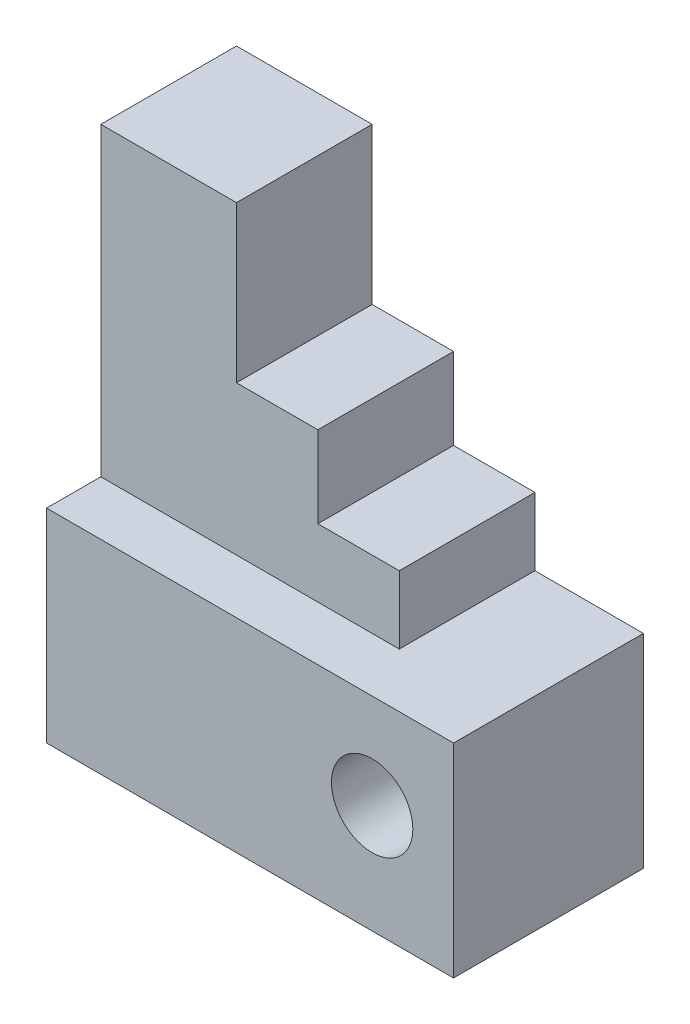
ISO-10303-21;
HEADER;
FILE_DESCRIPTION(('STEP AP214'),'2;1');
FILE_NAME('part.step','',(''),(''),'','','');
FILE_SCHEMA(('AUTOMOTIVE_DESIGN { 1 0 10303 214 1 1 1 1 }'));
ENDSEC;
DATA;
#1=APPLICATION_CONTEXT('core data for automotive mechanical design processes');
#2=APPLICATION_PROTOCOL_DEFINITION('international standard','automotive_design',2000,#1);
#3=PRODUCT_CONTEXT('',#1,'mechanical');
#4=PRODUCT('Part','Part','',(#3));
#5=PRODUCT_RELATED_PRODUCT_CATEGORY('part','',(#4));
#6=PRODUCT_DEFINITION_FORMATION('','',#4);
#7=PRODUCT_DEFINITION_CONTEXT('part definition',#1,'design');
#8=PRODUCT_DEFINITION('design','',#6,#7);
#9=PRODUCT_DEFINITION_SHAPE('','',#8);
#10=(LENGTH_UNIT() NAMED_UNIT(*) SI_UNIT(.MILLI.,.METRE.));
#11=(NAMED_UNIT(*) PLANE_ANGLE_UNIT() SI_UNIT($,.RADIAN.));
#12=(NAMED_UNIT(*) SI_UNIT($,.STERADIAN.) SOLID_ANGLE_UNIT());
#13=UNCERTAINTY_MEASURE_WITH_UNIT(LENGTH_MEASURE(1.E-05),#10,'distance_accuracy_value','');
#14=(GEOMETRIC_REPRESENTATION_CONTEXT(3) GLOBAL_UNCERTAINTY_ASSIGNED_CONTEXT((#13)) GLOBAL_UNIT_ASSIGNED_CONTEXT((#10,
#11,#12)) REPRESENTATION_CONTEXT('',''));
#15=CARTESIAN_POINT('',(0.,0.,0.));
#16=DIRECTION('',(0.,0.,1.));
#17=DIRECTION('',(1.,0.,0.));
#18=AXIS2_PLACEMENT_3D('',#15,#16,#17);
#19=CARTESIAN_POINT('',(0.,0.,28.));
#20=DIRECTION('',(0.,1.,0.));
#21=DIRECTION('',(0.,0.,1.));
#22=AXIS2_PLACEMENT_3D('',#19,#20,#21);
#23=PLANE('',#22);
#24=DIRECTION('',(1.,0.,0.));
#25=VECTOR('',#24,1.);
#26=CARTESIAN_POINT('',(0.,0.,0.));
#27=LINE('',#26,#25);
#28=CARTESIAN_POINT('',(0.,0.,0.));
#29=VERTEX_POINT('',#28);
#30=CARTESIAN_POINT('',(60.,0.,0.));
#31=VERTEX_POINT('',#30);
#32=EDGE_CURVE('E154',#29,#31,#27,.T.);
#33=ORIENTED_EDGE('',*,*,#32,.T.);
#34=DIRECTION('',(0.,0.,-1.));
#35=VECTOR('',#34,1.);
#36=CARTESIAN_POINT('',(60.,0.,28.));
#37=LINE('',#36,#35);
#38=CARTESIAN_POINT('',(60.,0.,28.));
#39=VERTEX_POINT('',#38);
#40=EDGE_CURVE('E11',#39,#31,#37,.T.);
#41=ORIENTED_EDGE('',*,*,#40,.F.);
#42=DIRECTION('',(1.,0.,0.));
#43=VECTOR('',#42,1.);
#44=CARTESIAN_POINT('',(0.,0.,28.));
#45=LINE('',#44,#43);
#46=CARTESIAN_POINT('',(0.,0.,28.));
#47=VERTEX_POINT('',#46);
#48=EDGE_CURVE('E164',#47,#39,#45,.T.);
#49=ORIENTED_EDGE('',*,*,#48,.F.);
#50=DIRECTION('',(0.,0.,-1.));
#51=VECTOR('',#50,1.);
#52=CARTESIAN_POINT('',(0.,0.,28.));
#53=LINE('',#52,#51);
#54=EDGE_CURVE('E179',#47,#29,#53,.T.);
#55=ORIENTED_EDGE('',*,*,#54,.T.);
#56=EDGE_LOOP('',(#33,#41,#49,#55));
#57=FACE_BOUND('',#56,.T.);
#58=ADVANCED_FACE('F41',(#57),#23,.F.);
#59=CARTESIAN_POINT('',(60.,0.,28.));
#60=DIRECTION('',(-1.,0.,0.));
#61=DIRECTION('',(0.,0.,1.));
#62=AXIS2_PLACEMENT_3D('',#59,#60,#61);
#63=PLANE('',#62);
#64=DIRECTION('',(0.,1.,0.));
#65=VECTOR('',#64,1.);
#66=CARTESIAN_POINT('',(60.,0.,0.));
#67=LINE('',#66,#65);
#68=CARTESIAN_POINT('',(60.,30.,0.));
#69=VERTEX_POINT('',#68);
#70=EDGE_CURVE('E184',#31,#69,#67,.T.);
#71=ORIENTED_EDGE('',*,*,#70,.T.);
#72=DIRECTION('',(0.,0.,-1.));
#73=VECTOR('',#72,1.);
#74=CARTESIAN_POINT('',(60.,30.,28.));
#75=LINE('',#74,#73);
#76=CARTESIAN_POINT('',(60.,30.,28.));
#77=VERTEX_POINT('',#76);
#78=EDGE_CURVE('E50',#77,#69,#75,.T.);
#79=ORIENTED_EDGE('',*,*,#78,.F.);
#80=DIRECTION('',(0.,1.,0.));
#81=VECTOR('',#80,1.);
#82=CARTESIAN_POINT('',(60.,0.,28.));
#83=LINE('',#82,#81);
#84=EDGE_CURVE('E169',#39,#77,#83,.T.);
#85=ORIENTED_EDGE('',*,*,#84,.F.);
#86=ORIENTED_EDGE('',*,*,#40,.T.);
#87=EDGE_LOOP('',(#71,#79,#85,#86));
#88=FACE_BOUND('',#87,.T.);
#89=ADVANCED_FACE('F201',(#88),#63,.F.);
#90=CARTESIAN_POINT('',(0.,30.,28.));
#91=DIRECTION('',(0.,1.,0.));
#92=DIRECTION('',(0.,0.,1.));
#93=AXIS2_PLACEMENT_3D('',#90,#91,#92);
#94=PLANE('',#93);
#95=DIRECTION('',(0.,0.,-1.));
#96=VECTOR('',#95,1.);
#97=CARTESIAN_POINT('',(44.,30.,20.));
#98=LINE('',#97,#96);
#99=CARTESIAN_POINT('',(44.,30.,20.));
#100=VERTEX_POINT('',#99);
#101=CARTESIAN_POINT('',(44.,30.,0.));
#102=VERTEX_POINT('',#101);
#103=EDGE_CURVE('E228',#100,#102,#98,.T.);
#104=ORIENTED_EDGE('',*,*,#103,.F.);
#105=DIRECTION('',(1.,0.,0.));
#106=VECTOR('',#105,1.);
#107=CARTESIAN_POINT('',(44.,30.,20.));
#108=LINE('',#107,#106);
#109=CARTESIAN_POINT('',(0.,30.,20.));
#110=VERTEX_POINT('',#109);
#111=EDGE_CURVE('E57',#110,#100,#108,.T.);
#112=ORIENTED_EDGE('',*,*,#111,.F.);
#113=DIRECTION('',(0.,0.,-1.));
#114=VECTOR('',#113,1.);
#115=CARTESIAN_POINT('',(0.,30.,28.));
#116=LINE('',#115,#114);
#117=CARTESIAN_POINT('',(0.,30.,28.));
#118=VERTEX_POINT('',#117);
#119=EDGE_CURVE('E194',#118,#110,#116,.T.);
#120=ORIENTED_EDGE('',*,*,#119,.F.);
#121=DIRECTION('',(1.,0.,0.));
#122=VECTOR('',#121,1.);
#123=CARTESIAN_POINT('',(0.,30.,28.));
#124=LINE('',#123,#122);
#125=EDGE_CURVE('E172',#118,#77,#124,.T.);
#126=ORIENTED_EDGE('',*,*,#125,.T.);
#127=ORIENTED_EDGE('',*,*,#78,.T.);
#128=DIRECTION('',(1.,0.,0.));
#129=VECTOR('',#128,1.);
#130=CARTESIAN_POINT('',(0.,30.,0.));
#131=LINE('',#130,#129);
#132=EDGE_CURVE('E63',#102,#69,#131,.T.);
#133=ORIENTED_EDGE('',*,*,#132,.F.);
#134=EDGE_LOOP('',(#104,#112,#120,#126,#127,#133));
#135=FACE_BOUND('',#134,.T.);
#136=ADVANCED_FACE('F198',(#135),#94,.T.);
#137=CARTESIAN_POINT('',(48.,16.,28.));
#138=DIRECTION('',(0.,0.,-1.));
#139=DIRECTION('',(-1.,0.,0.));
#140=AXIS2_PLACEMENT_3D('',#137,#138,#139);
#141=CYLINDRICAL_SURFACE('',#140,5.99999999999999);
#142=CARTESIAN_POINT('',(48.,16.,28.));
#143=DIRECTION('',(0.,0.,1.));
#144=DIRECTION('',(1.,0.,0.));
#145=AXIS2_PLACEMENT_3D('',#142,#143,#144);
#146=CIRCLE('',#145,5.99999999999999);
#147=CARTESIAN_POINT('',(54.,16.,28.));
#148=VERTEX_POINT('',#147);
#149=EDGE_CURVE('E160',#148,#148,#146,.T.);
#150=ORIENTED_EDGE('',*,*,#149,.T.);
#151=EDGE_LOOP('',(#150));
#152=FACE_BOUND('',#151,.T.);
#153=CARTESIAN_POINT('',(48.,16.,0.));
#154=DIRECTION('',(0.,0.,1.));
#155=DIRECTION('',(1.,0.,0.));
#156=AXIS2_PLACEMENT_3D('',#153,#154,#155);
#157=CIRCLE('',#156,5.99999999999999);
#158=CARTESIAN_POINT('',(54.,16.,0.));
#159=VERTEX_POINT('',#158);
#160=EDGE_CURVE('E149',#159,#159,#157,.T.);
#161=ORIENTED_EDGE('',*,*,#160,.F.);
#162=EDGE_LOOP('',(#161));
#163=FACE_BOUND('',#162,.T.);
#164=ADVANCED_FACE('F43',(#152,#163),#141,.F.);
#165=CARTESIAN_POINT('',(0.,0.,28.));
#166=DIRECTION('',(-1.,0.,0.));
#167=DIRECTION('',(0.,0.,1.));
#168=AXIS2_PLACEMENT_3D('',#165,#166,#167);
#169=PLANE('',#168);
#170=DIRECTION('',(0.,1.,0.));
#171=VECTOR('',#170,1.);
#172=CARTESIAN_POINT('',(0.,0.,0.));
#173=LINE('',#172,#171);
#174=CARTESIAN_POINT('',(0.,75.,0.));
#175=VERTEX_POINT('',#174);
#176=EDGE_CURVE('E165',#29,#175,#173,.T.);
#177=ORIENTED_EDGE('',*,*,#176,.F.);
#178=ORIENTED_EDGE('',*,*,#54,.F.);
#179=DIRECTION('',(0.,1.,0.));
#180=VECTOR('',#179,1.);
#181=CARTESIAN_POINT('',(0.,0.,28.));
#182=LINE('',#181,#180);
#183=EDGE_CURVE('E176',#47,#118,#182,.T.);
#184=ORIENTED_EDGE('',*,*,#183,.T.);
#185=ORIENTED_EDGE('',*,*,#119,.T.);
#186=DIRECTION('',(0.,-1.,0.));
#187=VECTOR('',#186,1.);
#188=CARTESIAN_POINT('',(0.,30.,20.));
#189=LINE('',#188,#187);
#190=CARTESIAN_POINT('',(0.,75.,20.));
#191=VERTEX_POINT('',#190);
#192=EDGE_CURVE('E265',#191,#110,#189,.T.);
#193=ORIENTED_EDGE('',*,*,#192,.F.);
#194=DIRECTION('',(0.,0.,-1.));
#195=VECTOR('',#194,1.);
#196=CARTESIAN_POINT('',(0.,75.,20.));
#197=LINE('',#196,#195);
#198=EDGE_CURVE('E231',#191,#175,#197,.T.);
#199=ORIENTED_EDGE('',*,*,#198,.T.);
#200=EDGE_LOOP('',(#177,#178,#184,#185,#193,#199));
#201=FACE_BOUND('',#200,.T.);
#202=ADVANCED_FACE('F293',(#201),#169,.T.);
#203=CARTESIAN_POINT('',(0.,0.,28.));
#204=DIRECTION('',(0.,0.,1.));
#205=DIRECTION('',(1.,0.,0.));
#206=AXIS2_PLACEMENT_3D('',#203,#204,#205);
#207=PLANE('',#206);
#208=ORIENTED_EDGE('',*,*,#149,.F.);
#209=EDGE_LOOP('',(#208));
#210=FACE_BOUND('',#209,.T.);
#211=ORIENTED_EDGE('',*,*,#48,.T.);
#212=ORIENTED_EDGE('',*,*,#84,.T.);
#213=ORIENTED_EDGE('',*,*,#125,.F.);
#214=ORIENTED_EDGE('',*,*,#183,.F.);
#215=EDGE_LOOP('',(#211,#212,#213,#214));
#216=FACE_BOUND('',#215,.T.);
#217=ADVANCED_FACE('F296',(#210,#216),#207,.T.);
#218=CARTESIAN_POINT('',(0.,0.,0.));
#219=DIRECTION('',(0.,0.,1.));
#220=DIRECTION('',(1.,0.,0.));
#221=AXIS2_PLACEMENT_3D('',#218,#219,#220);
#222=PLANE('',#221);
#223=ORIENTED_EDGE('',*,*,#160,.T.);
#224=EDGE_LOOP('',(#223));
#225=FACE_BOUND('',#224,.T.);
#226=ORIENTED_EDGE('',*,*,#32,.F.);
#227=ORIENTED_EDGE('',*,*,#176,.T.);
#228=DIRECTION('',(-1.,0.,0.));
#229=VECTOR('',#228,1.);
#230=CARTESIAN_POINT('',(0.,75.,0.));
#231=LINE('',#230,#229);
#232=CARTESIAN_POINT('',(20.,75.,0.));
#233=VERTEX_POINT('',#232);
#234=EDGE_CURVE('E143',#233,#175,#231,.T.);
#235=ORIENTED_EDGE('',*,*,#234,.F.);
#236=DIRECTION('',(0.,1.,0.));
#237=VECTOR('',#236,1.);
#238=CARTESIAN_POINT('',(20.,75.,0.));
#239=LINE('',#238,#237);
#240=CARTESIAN_POINT('',(20.,52.,0.));
#241=VERTEX_POINT('',#240);
#242=EDGE_CURVE('E222',#241,#233,#239,.T.);
#243=ORIENTED_EDGE('',*,*,#242,.F.);
#244=DIRECTION('',(-1.,0.,0.));
#245=VECTOR('',#244,1.);
#246=CARTESIAN_POINT('',(20.,52.,0.));
#247=LINE('',#246,#245);
#248=CARTESIAN_POINT('',(32.,52.,0.));
#249=VERTEX_POINT('',#248);
#250=EDGE_CURVE('E219',#249,#241,#247,.T.);
#251=ORIENTED_EDGE('',*,*,#250,.F.);
#252=DIRECTION('',(0.,1.,0.));
#253=VECTOR('',#252,1.);
#254=CARTESIAN_POINT('',(32.,52.,0.));
#255=LINE('',#254,#253);
#256=CARTESIAN_POINT('',(32.,40.,0.));
#257=VERTEX_POINT('',#256);
#258=EDGE_CURVE('E212',#257,#249,#255,.T.);
#259=ORIENTED_EDGE('',*,*,#258,.F.);
#260=DIRECTION('',(-1.,0.,0.));
#261=VECTOR('',#260,1.);
#262=CARTESIAN_POINT('',(32.,40.,0.));
#263=LINE('',#262,#261);
#264=CARTESIAN_POINT('',(44.,40.,0.));
#265=VERTEX_POINT('',#264);
#266=EDGE_CURVE('E208',#265,#257,#263,.T.);
#267=ORIENTED_EDGE('',*,*,#266,.F.);
#268=DIRECTION('',(0.,1.,0.));
#269=VECTOR('',#268,1.);
#270=CARTESIAN_POINT('',(44.,40.,0.));
#271=LINE('',#270,#269);
#272=EDGE_CURVE('E147',#102,#265,#271,.T.);
#273=ORIENTED_EDGE('',*,*,#272,.F.);
#274=ORIENTED_EDGE('',*,*,#132,.T.);
#275=ORIENTED_EDGE('',*,*,#70,.F.);
#276=EDGE_LOOP('',(#226,#227,#235,#243,#251,#259,#267,#273,#274,#275));
#277=FACE_BOUND('',#276,.T.);
#278=ADVANCED_FACE('F205',(#225,#277),#222,.F.);
#279=CARTESIAN_POINT('',(44.,40.,20.));
#280=DIRECTION('',(-1.,0.,0.));
#281=DIRECTION('',(0.,0.,1.));
#282=AXIS2_PLACEMENT_3D('',#279,#280,#281);
#283=PLANE('',#282);
#284=ORIENTED_EDGE('',*,*,#272,.T.);
#285=DIRECTION('',(0.,0.,-1.));
#286=VECTOR('',#285,1.);
#287=CARTESIAN_POINT('',(44.,40.,20.));
#288=LINE('',#287,#286);
#289=CARTESIAN_POINT('',(44.,40.,20.));
#290=VERTEX_POINT('',#289);
#291=EDGE_CURVE('E128',#290,#265,#288,.T.);
#292=ORIENTED_EDGE('',*,*,#291,.F.);
#293=DIRECTION('',(0.,1.,0.));
#294=VECTOR('',#293,1.);
#295=CARTESIAN_POINT('',(44.,40.,20.));
#296=LINE('',#295,#294);
#297=EDGE_CURVE('E136',#100,#290,#296,.T.);
#298=ORIENTED_EDGE('',*,*,#297,.F.);
#299=ORIENTED_EDGE('',*,*,#103,.T.);
#300=EDGE_LOOP('',(#284,#292,#298,#299));
#301=FACE_BOUND('',#300,.T.);
#302=ADVANCED_FACE('F145',(#301),#283,.F.);
#303=CARTESIAN_POINT('',(32.,40.,20.));
#304=DIRECTION('',(0.,-1.,0.));
#305=DIRECTION('',(0.,0.,-1.));
#306=AXIS2_PLACEMENT_3D('',#303,#304,#305);
#307=PLANE('',#306);
#308=ORIENTED_EDGE('',*,*,#266,.T.);
#309=DIRECTION('',(0.,0.,-1.));
#310=VECTOR('',#309,1.);
#311=CARTESIAN_POINT('',(32.,40.,20.));
#312=LINE('',#311,#310);
#313=CARTESIAN_POINT('',(32.,40.,20.));
#314=VERTEX_POINT('',#313);
#315=EDGE_CURVE('E131',#314,#257,#312,.T.);
#316=ORIENTED_EDGE('',*,*,#315,.F.);
#317=DIRECTION('',(-1.,0.,0.));
#318=VECTOR('',#317,1.);
#319=CARTESIAN_POINT('',(32.,40.,20.));
#320=LINE('',#319,#318);
#321=EDGE_CURVE('E124',#290,#314,#320,.T.);
#322=ORIENTED_EDGE('',*,*,#321,.F.);
#323=ORIENTED_EDGE('',*,*,#291,.T.);
#324=EDGE_LOOP('',(#308,#316,#322,#323));
#325=FACE_BOUND('',#324,.T.);
#326=ADVANCED_FACE('F126',(#325),#307,.F.);
#327=CARTESIAN_POINT('',(32.,52.,20.));
#328=DIRECTION('',(-1.,0.,0.));
#329=DIRECTION('',(0.,0.,1.));
#330=AXIS2_PLACEMENT_3D('',#327,#328,#329);
#331=PLANE('',#330);
#332=ORIENTED_EDGE('',*,*,#258,.T.);
#333=DIRECTION('',(0.,0.,-1.));
#334=VECTOR('',#333,1.);
#335=CARTESIAN_POINT('',(32.,52.,20.));
#336=LINE('',#335,#334);
#337=CARTESIAN_POINT('',(32.,52.,20.));
#338=VERTEX_POINT('',#337);
#339=EDGE_CURVE('E156',#338,#249,#336,.T.);
#340=ORIENTED_EDGE('',*,*,#339,.F.);
#341=DIRECTION('',(0.,1.,0.));
#342=VECTOR('',#341,1.);
#343=CARTESIAN_POINT('',(32.,52.,20.));
#344=LINE('',#343,#342);
#345=EDGE_CURVE('E135',#314,#338,#344,.T.);
#346=ORIENTED_EDGE('',*,*,#345,.F.);
#347=ORIENTED_EDGE('',*,*,#315,.T.);
#348=EDGE_LOOP('',(#332,#340,#346,#347));
#349=FACE_BOUND('',#348,.T.);
#350=ADVANCED_FACE('F275',(#349),#331,.F.);
#351=CARTESIAN_POINT('',(20.,52.,20.));
#352=DIRECTION('',(0.,-1.,0.));
#353=DIRECTION('',(0.,0.,-1.));
#354=AXIS2_PLACEMENT_3D('',#351,#352,#353);
#355=PLANE('',#354);
#356=ORIENTED_EDGE('',*,*,#250,.T.);
#357=DIRECTION('',(0.,0.,-1.));
#358=VECTOR('',#357,1.);
#359=CARTESIAN_POINT('',(20.,52.,20.));
#360=LINE('',#359,#358);
#361=CARTESIAN_POINT('',(20.,52.,20.));
#362=VERTEX_POINT('',#361);
#363=EDGE_CURVE('E239',#362,#241,#360,.T.);
#364=ORIENTED_EDGE('',*,*,#363,.F.);
#365=DIRECTION('',(-1.,0.,0.));
#366=VECTOR('',#365,1.);
#367=CARTESIAN_POINT('',(20.,52.,20.));
#368=LINE('',#367,#366);
#369=EDGE_CURVE('E250',#338,#362,#368,.T.);
#370=ORIENTED_EDGE('',*,*,#369,.F.);
#371=ORIENTED_EDGE('',*,*,#339,.T.);
#372=EDGE_LOOP('',(#356,#364,#370,#371));
#373=FACE_BOUND('',#372,.T.);
#374=ADVANCED_FACE('F248',(#373),#355,.F.);
#375=CARTESIAN_POINT('',(20.,75.,20.));
#376=DIRECTION('',(-1.,0.,0.));
#377=DIRECTION('',(0.,-1.,0.));
#378=AXIS2_PLACEMENT_3D('',#375,#376,#377);
#379=PLANE('',#378);
#380=ORIENTED_EDGE('',*,*,#242,.T.);
#381=DIRECTION('',(0.,0.,-1.));
#382=VECTOR('',#381,1.);
#383=CARTESIAN_POINT('',(20.,75.,20.));
#384=LINE('',#383,#382);
#385=CARTESIAN_POINT('',(20.,75.,20.));
#386=VERTEX_POINT('',#385);
#387=EDGE_CURVE('E235',#386,#233,#384,.T.);
#388=ORIENTED_EDGE('',*,*,#387,.F.);
#389=DIRECTION('',(0.,1.,0.));
#390=VECTOR('',#389,1.);
#391=CARTESIAN_POINT('',(20.,75.,20.));
#392=LINE('',#391,#390);
#393=EDGE_CURVE('E266',#362,#386,#392,.T.);
#394=ORIENTED_EDGE('',*,*,#393,.F.);
#395=ORIENTED_EDGE('',*,*,#363,.T.);
#396=EDGE_LOOP('',(#380,#388,#394,#395));
#397=FACE_BOUND('',#396,.T.);
#398=ADVANCED_FACE('F256',(#397),#379,.F.);
#399=CARTESIAN_POINT('',(0.,75.,20.));
#400=DIRECTION('',(0.,-1.,0.));
#401=DIRECTION('',(0.,0.,-1.));
#402=AXIS2_PLACEMENT_3D('',#399,#400,#401);
#403=PLANE('',#402);
#404=ORIENTED_EDGE('',*,*,#234,.T.);
#405=ORIENTED_EDGE('',*,*,#198,.F.);
#406=DIRECTION('',(-1.,0.,0.));
#407=VECTOR('',#406,1.);
#408=CARTESIAN_POINT('',(0.,75.,20.));
#409=LINE('',#408,#407);
#410=EDGE_CURVE('E262',#386,#191,#409,.T.);
#411=ORIENTED_EDGE('',*,*,#410,.F.);
#412=ORIENTED_EDGE('',*,*,#387,.T.);
#413=EDGE_LOOP('',(#404,#405,#411,#412));
#414=FACE_BOUND('',#413,.T.);
#415=ADVANCED_FACE('F260',(#414),#403,.F.);
#416=CARTESIAN_POINT('',(0.,0.,20.));
#417=DIRECTION('',(0.,0.,-1.));
#418=DIRECTION('',(-1.,0.,0.));
#419=AXIS2_PLACEMENT_3D('',#416,#417,#418);
#420=PLANE('',#419);
#421=ORIENTED_EDGE('',*,*,#297,.T.);
#422=ORIENTED_EDGE('',*,*,#321,.T.);
#423=ORIENTED_EDGE('',*,*,#345,.T.);
#424=ORIENTED_EDGE('',*,*,#369,.T.);
#425=ORIENTED_EDGE('',*,*,#393,.T.);
#426=ORIENTED_EDGE('',*,*,#410,.T.);
#427=ORIENTED_EDGE('',*,*,#192,.T.);
#428=ORIENTED_EDGE('',*,*,#111,.T.);
#429=EDGE_LOOP('',(#421,#422,#423,#424,#425,#426,#427,#428));
#430=FACE_BOUND('',#429,.T.);
#431=ADVANCED_FACE('F139',(#430),#420,.F.);
#432=CLOSED_SHELL('',(#58,#89,#136,#164,#202,#217,#278,#302,#326,#350,#374,#398,#415,#431));
#433=MANIFOLD_SOLID_BREP('B2',#432);
#434=ADVANCED_BREP_SHAPE_REPRESENTATION('',(#18,#433),#14);
#435=SHAPE_DEFINITION_REPRESENTATION(#9,#434);
ENDSEC;
END-ISO-10303-21;
